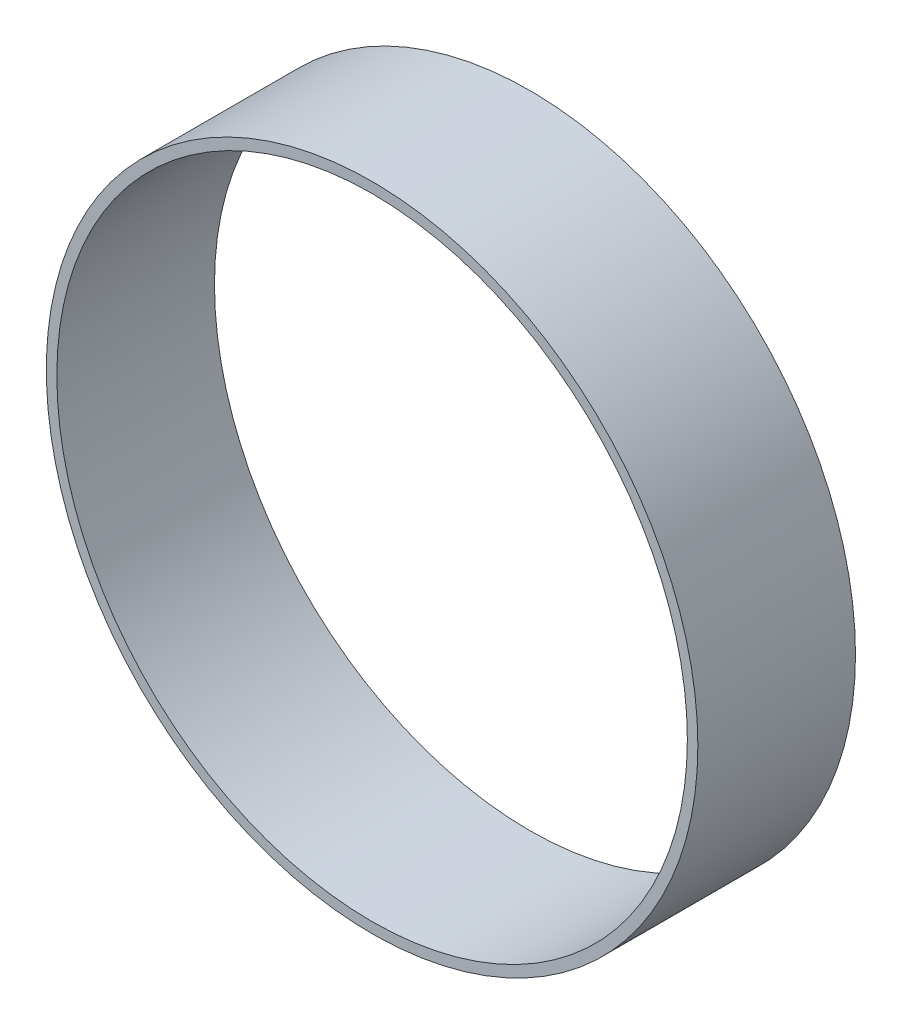
ISO-10303-21;
HEADER;
FILE_DESCRIPTION(('STEP AP214'),'2;1');
FILE_NAME('part.step','',(''),(''),'','','');
FILE_SCHEMA(('AUTOMOTIVE_DESIGN { 1 0 10303 214 1 1 1 1 }'));
ENDSEC;
DATA;
#1=APPLICATION_CONTEXT('core data for automotive mechanical design processes');
#2=APPLICATION_PROTOCOL_DEFINITION('international standard','automotive_design',2000,#1);
#3=PRODUCT_CONTEXT('',#1,'mechanical');
#4=PRODUCT('Part','Part','',(#3));
#5=PRODUCT_RELATED_PRODUCT_CATEGORY('part','',(#4));
#6=PRODUCT_DEFINITION_FORMATION('','',#4);
#7=PRODUCT_DEFINITION_CONTEXT('part definition',#1,'design');
#8=PRODUCT_DEFINITION('design','',#6,#7);
#9=PRODUCT_DEFINITION_SHAPE('','',#8);
#10=(LENGTH_UNIT() NAMED_UNIT(*) SI_UNIT(.MILLI.,.METRE.));
#11=(NAMED_UNIT(*) PLANE_ANGLE_UNIT() SI_UNIT($,.RADIAN.));
#12=(NAMED_UNIT(*) SI_UNIT($,.STERADIAN.) SOLID_ANGLE_UNIT());
#13=UNCERTAINTY_MEASURE_WITH_UNIT(LENGTH_MEASURE(1.E-05),#10,'distance_accuracy_value','');
#14=(GEOMETRIC_REPRESENTATION_CONTEXT(3) GLOBAL_UNCERTAINTY_ASSIGNED_CONTEXT((#13)) GLOBAL_UNIT_ASSIGNED_CONTEXT((#10,
#11,#12)) REPRESENTATION_CONTEXT('',''));
#15=CARTESIAN_POINT('',(0.,0.,0.));
#16=DIRECTION('',(0.,0.,1.));
#17=DIRECTION('',(1.,0.,0.));
#18=AXIS2_PLACEMENT_3D('',#15,#16,#17);
#19=CARTESIAN_POINT('',(0.,0.,15.));
#20=DIRECTION('',(0.,0.,1.));
#21=DIRECTION('',(1.,0.,0.));
#22=AXIS2_PLACEMENT_3D('',#19,#20,#21);
#23=PLANE('',#22);
#24=CARTESIAN_POINT('',(0.,0.,15.));
#25=DIRECTION('',(0.,0.,1.));
#26=DIRECTION('',(1.,0.,0.));
#27=AXIS2_PLACEMENT_3D('',#24,#25,#26);
#28=CIRCLE('',#27,31.);
#29=CARTESIAN_POINT('',(31.,0.,15.));
#30=VERTEX_POINT('',#29);
#31=EDGE_CURVE('E10',#30,#30,#28,.T.);
#32=ORIENTED_EDGE('',*,*,#31,.T.);
#33=EDGE_LOOP('',(#32));
#34=FACE_BOUND('',#33,.T.);
#35=CARTESIAN_POINT('',(0.,0.,15.));
#36=DIRECTION('',(0.,0.,1.));
#37=DIRECTION('',(1.,0.,0.));
#38=AXIS2_PLACEMENT_3D('',#35,#36,#37);
#39=CIRCLE('',#38,30.);
#40=CARTESIAN_POINT('',(30.,0.,15.));
#41=VERTEX_POINT('',#40);
#42=EDGE_CURVE('E54',#41,#41,#39,.T.);
#43=ORIENTED_EDGE('',*,*,#42,.F.);
#44=EDGE_LOOP('',(#43));
#45=FACE_BOUND('',#44,.T.);
#46=ADVANCED_FACE('F41',(#34,#45),#23,.T.);
#47=CARTESIAN_POINT('',(0.,0.,0.));
#48=DIRECTION('',(0.,0.,1.));
#49=DIRECTION('',(1.,0.,0.));
#50=AXIS2_PLACEMENT_3D('',#47,#48,#49);
#51=PLANE('',#50);
#52=CARTESIAN_POINT('',(0.,0.,0.));
#53=DIRECTION('',(0.,0.,1.));
#54=DIRECTION('',(1.,0.,0.));
#55=AXIS2_PLACEMENT_3D('',#52,#53,#54);
#56=CIRCLE('',#55,31.);
#57=CARTESIAN_POINT('',(31.,0.,0.));
#58=VERTEX_POINT('',#57);
#59=EDGE_CURVE('E45',#58,#58,#56,.T.);
#60=ORIENTED_EDGE('',*,*,#59,.F.);
#61=EDGE_LOOP('',(#60));
#62=FACE_BOUND('',#61,.T.);
#63=CARTESIAN_POINT('',(0.,0.,0.));
#64=DIRECTION('',(0.,0.,1.));
#65=DIRECTION('',(1.,0.,0.));
#66=AXIS2_PLACEMENT_3D('',#63,#64,#65);
#67=CIRCLE('',#66,30.);
#68=CARTESIAN_POINT('',(30.,0.,0.));
#69=VERTEX_POINT('',#68);
#70=EDGE_CURVE('E56',#69,#69,#67,.T.);
#71=ORIENTED_EDGE('',*,*,#70,.T.);
#72=EDGE_LOOP('',(#71));
#73=FACE_BOUND('',#72,.T.);
#74=ADVANCED_FACE('F68',(#62,#73),#51,.F.);
#75=CARTESIAN_POINT('',(0.,0.,15.));
#76=DIRECTION('',(0.,0.,-1.));
#77=DIRECTION('',(-1.,0.,0.));
#78=AXIS2_PLACEMENT_3D('',#75,#76,#77);
#79=CYLINDRICAL_SURFACE('',#78,31.);
#80=ORIENTED_EDGE('',*,*,#31,.F.);
#81=EDGE_LOOP('',(#80));
#82=FACE_BOUND('',#81,.T.);
#83=ORIENTED_EDGE('',*,*,#59,.T.);
#84=EDGE_LOOP('',(#83));
#85=FACE_BOUND('',#84,.T.);
#86=ADVANCED_FACE('F43',(#82,#85),#79,.T.);
#87=CARTESIAN_POINT('',(0.,0.,15.));
#88=DIRECTION('',(0.,0.,-1.));
#89=DIRECTION('',(-1.,0.,0.));
#90=AXIS2_PLACEMENT_3D('',#87,#88,#89);
#91=CYLINDRICAL_SURFACE('',#90,30.);
#92=ORIENTED_EDGE('',*,*,#42,.T.);
#93=EDGE_LOOP('',(#92));
#94=FACE_BOUND('',#93,.T.);
#95=ORIENTED_EDGE('',*,*,#70,.F.);
#96=EDGE_LOOP('',(#95));
#97=FACE_BOUND('',#96,.T.);
#98=ADVANCED_FACE('F64',(#94,#97),#91,.F.);
#99=CLOSED_SHELL('',(#46,#74,#86,#98));
#100=MANIFOLD_SOLID_BREP('B2',#99);
#101=ADVANCED_BREP_SHAPE_REPRESENTATION('',(#18,#100),#14);
#102=SHAPE_DEFINITION_REPRESENTATION(#9,#101);
ENDSEC;
END-ISO-10303-21;
